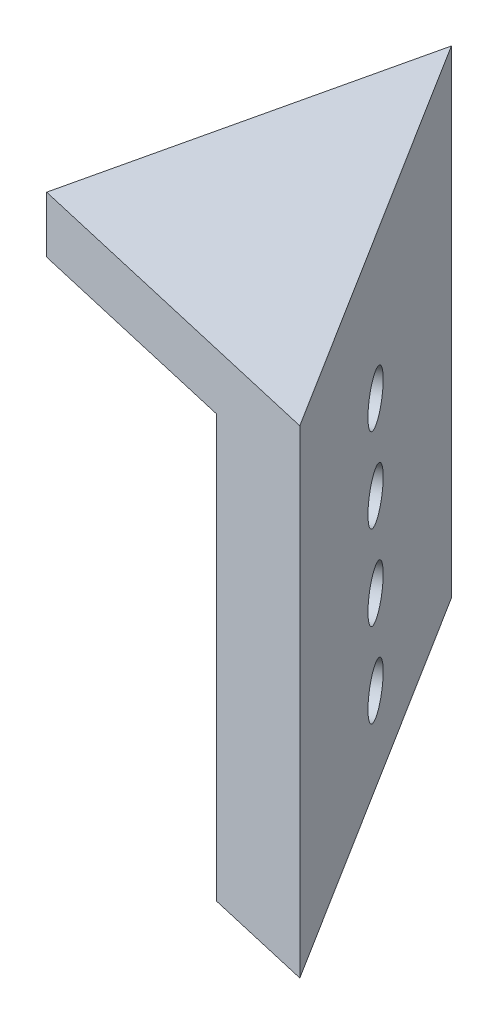
ISO-10303-21;
HEADER;
FILE_DESCRIPTION(('STEP AP214'),'2;1');
FILE_NAME('part.step','',(''),(''),'','','');
FILE_SCHEMA(('AUTOMOTIVE_DESIGN { 1 0 10303 214 1 1 1 1 }'));
ENDSEC;
DATA;
#1=APPLICATION_CONTEXT('core data for automotive mechanical design processes');
#2=APPLICATION_PROTOCOL_DEFINITION('international standard','automotive_design',2000,#1);
#3=PRODUCT_CONTEXT('',#1,'mechanical');
#4=PRODUCT('Part','Part','',(#3));
#5=PRODUCT_RELATED_PRODUCT_CATEGORY('part','',(#4));
#6=PRODUCT_DEFINITION_FORMATION('','',#4);
#7=PRODUCT_DEFINITION_CONTEXT('part definition',#1,'design');
#8=PRODUCT_DEFINITION('design','',#6,#7);
#9=PRODUCT_DEFINITION_SHAPE('','',#8);
#10=(LENGTH_UNIT() NAMED_UNIT(*) SI_UNIT(.MILLI.,.METRE.));
#11=(NAMED_UNIT(*) PLANE_ANGLE_UNIT() SI_UNIT($,.RADIAN.));
#12=(NAMED_UNIT(*) SI_UNIT($,.STERADIAN.) SOLID_ANGLE_UNIT());
#13=UNCERTAINTY_MEASURE_WITH_UNIT(LENGTH_MEASURE(1.E-05),#10,'distance_accuracy_value','');
#14=(GEOMETRIC_REPRESENTATION_CONTEXT(3) GLOBAL_UNCERTAINTY_ASSIGNED_CONTEXT((#13)) GLOBAL_UNIT_ASSIGNED_CONTEXT((#10,
#11,#12)) REPRESENTATION_CONTEXT('',''));
#15=CARTESIAN_POINT('',(0.,0.,0.));
#16=DIRECTION('',(0.,0.,1.));
#17=DIRECTION('',(1.,0.,0.));
#18=AXIS2_PLACEMENT_3D('',#15,#16,#17);
#19=CARTESIAN_POINT('',(0.,25.4,0.));
#20=DIRECTION('',(0.974478940414093,0.,0.224478940414076));
#21=DIRECTION('',(0.224478940414076,0.,-0.974478940414093));
#22=AXIS2_PLACEMENT_3D('',#19,#20,#21);
#23=PLANE('',#22);
#24=DIRECTION('',(0.,-1.,0.));
#25=VECTOR('',#24,1.);
#26=CARTESIAN_POINT('',(0.,25.4,0.));
#27=LINE('',#26,#25);
#28=CARTESIAN_POINT('',(0.,25.4,0.));
#29=VERTEX_POINT('',#28);
#30=CARTESIAN_POINT('',(0.,0.,0.));
#31=VERTEX_POINT('',#30);
#32=EDGE_CURVE('E53',#29,#31,#27,.T.);
#33=ORIENTED_EDGE('',*,*,#32,.F.);
#34=DIRECTION('',(-0.224478940414076,0.,0.974478940414093));
#35=VECTOR('',#34,1.);
#36=CARTESIAN_POINT('',(0.,25.4,0.));
#37=LINE('',#36,#35);
#38=CARTESIAN_POINT('',(34.2105905191077,25.4,-148.510590519119));
#39=VERTEX_POINT('',#38);
#40=EDGE_CURVE('E100',#39,#29,#37,.T.);
#41=ORIENTED_EDGE('',*,*,#40,.F.);
#42=DIRECTION('',(0.,-1.,0.));
#43=VECTOR('',#42,1.);
#44=CARTESIAN_POINT('',(34.2105905191077,25.4,-148.510590519119));
#45=LINE('',#44,#43);
#46=CARTESIAN_POINT('',(34.2105905191077,-190.5,-148.510590519119));
#47=VERTEX_POINT('',#46);
#48=EDGE_CURVE('E97',#39,#47,#45,.T.);
#49=ORIENTED_EDGE('',*,*,#48,.T.);
#50=DIRECTION('',(-0.224478940414076,0.,0.974478940414093));
#51=VECTOR('',#50,1.);
#52=CARTESIAN_POINT('',(34.2105905191077,-190.5,-148.510590519119));
#53=LINE('',#52,#51);
#54=CARTESIAN_POINT('',(22.983547143726,-190.5,-99.7732020039908));
#55=VERTEX_POINT('',#54);
#56=EDGE_CURVE('E99',#47,#55,#53,.T.);
#57=ORIENTED_EDGE('',*,*,#56,.T.);
#58=DIRECTION('',(0.,1.,0.));
#59=VECTOR('',#58,1.);
#60=CARTESIAN_POINT('',(22.983547143726,-190.5,-99.7732020039908));
#61=LINE('',#60,#59);
#62=CARTESIAN_POINT('',(22.983547143726,0.,-99.7732020039908));
#63=VERTEX_POINT('',#62);
#64=EDGE_CURVE('E60',#55,#63,#61,.T.);
#65=ORIENTED_EDGE('',*,*,#64,.T.);
#66=DIRECTION('',(-0.224478940414076,0.,0.974478940414093));
#67=VECTOR('',#66,1.);
#68=CARTESIAN_POINT('',(0.,0.,0.));
#69=LINE('',#68,#67);
#70=EDGE_CURVE('E77',#63,#31,#69,.T.);
#71=ORIENTED_EDGE('',*,*,#70,.T.);
#72=EDGE_LOOP('',(#33,#41,#49,#57,#65,#71));
#73=FACE_BOUND('',#72,.T.);
#74=ADVANCED_FACE('F45',(#73),#23,.F.);
#75=CARTESIAN_POINT('',(0.,25.4,0.));
#76=DIRECTION('',(0.224478940414077,0.,-0.974478940414093));
#77=DIRECTION('',(-0.974478940414093,0.,-0.224478940414077));
#78=AXIS2_PLACEMENT_3D('',#75,#76,#77);
#79=PLANE('',#78);
#80=DIRECTION('',(0.974478940414093,0.,0.224478940414077));
#81=VECTOR('',#80,1.);
#82=CARTESIAN_POINT('',(0.,0.,0.));
#83=LINE('',#82,#81);
#84=CARTESIAN_POINT('',(99.7732020039835,0.,22.9835471437244));
#85=VERTEX_POINT('',#84);
#86=EDGE_CURVE('E139',#31,#85,#83,.T.);
#87=ORIENTED_EDGE('',*,*,#86,.T.);
#88=DIRECTION('',(0.,1.,0.));
#89=VECTOR('',#88,1.);
#90=CARTESIAN_POINT('',(99.7732020039835,-190.5,22.9835471437244));
#91=LINE('',#90,#89);
#92=CARTESIAN_POINT('',(99.7732020039835,-190.5,22.9835471437244));
#93=VERTEX_POINT('',#92);
#94=EDGE_CURVE('E85',#93,#85,#91,.T.);
#95=ORIENTED_EDGE('',*,*,#94,.F.);
#96=DIRECTION('',(0.974478940414093,0.,0.224478940414075));
#97=VECTOR('',#96,1.);
#98=CARTESIAN_POINT('',(148.510590519108,-190.5,34.2105905191052));
#99=LINE('',#98,#97);
#100=CARTESIAN_POINT('',(148.510590519108,-190.5,34.2105905191052));
#101=VERTEX_POINT('',#100);
#102=EDGE_CURVE('E129',#93,#101,#99,.T.);
#103=ORIENTED_EDGE('',*,*,#102,.T.);
#104=DIRECTION('',(0.,-1.,0.));
#105=VECTOR('',#104,1.);
#106=CARTESIAN_POINT('',(148.510590519108,25.4,34.2105905191053));
#107=LINE('',#106,#105);
#108=CARTESIAN_POINT('',(148.510590519108,25.4,34.2105905191053));
#109=VERTEX_POINT('',#108);
#110=EDGE_CURVE('E104',#109,#101,#107,.T.);
#111=ORIENTED_EDGE('',*,*,#110,.F.);
#112=DIRECTION('',(0.974478940414093,0.,0.224478940414077));
#113=VECTOR('',#112,1.);
#114=CARTESIAN_POINT('',(0.,25.4,0.));
#115=LINE('',#114,#113);
#116=EDGE_CURVE('E138',#29,#109,#115,.T.);
#117=ORIENTED_EDGE('',*,*,#116,.F.);
#118=ORIENTED_EDGE('',*,*,#32,.T.);
#119=EDGE_LOOP('',(#87,#95,#103,#111,#117,#118));
#120=FACE_BOUND('',#119,.T.);
#121=ADVANCED_FACE('F154',(#120),#79,.F.);
#122=CARTESIAN_POINT('',(148.510590519108,25.4,34.2105905191053));
#123=DIRECTION('',(-0.847791247890671,0.,0.530330085889891));
#124=DIRECTION('',(0.530330085889892,0.,0.847791247890671));
#125=AXIS2_PLACEMENT_3D('',#122,#123,#124);
#126=PLANE('',#125);
#127=CARTESIAN_POINT('',(91.360590519112,-38.1,-57.1500000000001));
#128=DIRECTION('',(-0.847791247890671,0.,0.530330085889891));
#129=DIRECTION('',(0.530330085889892,0.,0.847791247890671));
#130=AXIS2_PLACEMENT_3D('',#127,#128,#129);
#131=CIRCLE('',#130,10.795);
#132=CARTESIAN_POINT('',(97.0855037962934,-38.1,-47.9980934790203));
#133=VERTEX_POINT('',#132);
#134=EDGE_CURVE('E119',#133,#133,#131,.T.);
#135=ORIENTED_EDGE('',*,*,#134,.T.);
#136=EDGE_LOOP('',(#135));
#137=FACE_BOUND('',#136,.T.);
#138=CARTESIAN_POINT('',(91.360590519112,-76.2,-57.1500000000001));
#139=DIRECTION('',(-0.847791247890671,0.,0.530330085889891));
#140=DIRECTION('',(0.530330085889892,0.,0.847791247890671));
#141=AXIS2_PLACEMENT_3D('',#138,#139,#140);
#142=CIRCLE('',#141,10.795);
#143=CARTESIAN_POINT('',(97.0855037962934,-76.2,-47.9980934790203));
#144=VERTEX_POINT('',#143);
#145=EDGE_CURVE('E123',#144,#144,#142,.T.);
#146=ORIENTED_EDGE('',*,*,#145,.T.);
#147=EDGE_LOOP('',(#146));
#148=FACE_BOUND('',#147,.T.);
#149=CARTESIAN_POINT('',(91.360590519112,-114.3,-57.1500000000001));
#150=DIRECTION('',(-0.847791247890671,0.,0.530330085889891));
#151=DIRECTION('',(0.530330085889892,0.,0.847791247890671));
#152=AXIS2_PLACEMENT_3D('',#149,#150,#151);
#153=CIRCLE('',#152,10.795);
#154=CARTESIAN_POINT('',(97.0855037962934,-114.3,-47.9980934790203));
#155=VERTEX_POINT('',#154);
#156=EDGE_CURVE('E262',#155,#155,#153,.T.);
#157=ORIENTED_EDGE('',*,*,#156,.T.);
#158=EDGE_LOOP('',(#157));
#159=FACE_BOUND('',#158,.T.);
#160=CARTESIAN_POINT('',(91.360590519112,-152.4,-57.1500000000001));
#161=DIRECTION('',(-0.847791247890671,0.,0.530330085889891));
#162=DIRECTION('',(0.530330085889892,0.,0.847791247890671));
#163=AXIS2_PLACEMENT_3D('',#160,#161,#162);
#164=CIRCLE('',#163,10.795);
#165=CARTESIAN_POINT('',(97.0855037962934,-152.4,-47.9980934790203));
#166=VERTEX_POINT('',#165);
#167=EDGE_CURVE('E265',#166,#166,#164,.T.);
#168=ORIENTED_EDGE('',*,*,#167,.T.);
#169=EDGE_LOOP('',(#168));
#170=FACE_BOUND('',#169,.T.);
#171=ORIENTED_EDGE('',*,*,#110,.T.);
#172=DIRECTION('',(-0.530330085889891,0.,-0.84779124789067));
#173=VECTOR('',#172,1.);
#174=CARTESIAN_POINT('',(34.2105905191077,-190.5,-148.510590519119));
#175=LINE('',#174,#173);
#176=EDGE_CURVE('E111',#101,#47,#175,.T.);
#177=ORIENTED_EDGE('',*,*,#176,.T.);
#178=ORIENTED_EDGE('',*,*,#48,.F.);
#179=DIRECTION('',(-0.530330085889892,0.,-0.847791247890671));
#180=VECTOR('',#179,1.);
#181=CARTESIAN_POINT('',(148.510590519108,25.4,34.2105905191053));
#182=LINE('',#181,#180);
#183=EDGE_CURVE('E68',#109,#39,#182,.T.);
#184=ORIENTED_EDGE('',*,*,#183,.F.);
#185=EDGE_LOOP('',(#171,#177,#178,#184));
#186=FACE_BOUND('',#185,.T.);
#187=ADVANCED_FACE('F116',(#137,#148,#159,#170,#186),#126,.F.);
#188=CARTESIAN_POINT('',(0.,25.4,0.));
#189=DIRECTION('',(0.,-1.,0.));
#190=DIRECTION('',(0.,0.,-1.));
#191=AXIS2_PLACEMENT_3D('',#188,#189,#190);
#192=PLANE('',#191);
#193=ORIENTED_EDGE('',*,*,#116,.T.);
#194=ORIENTED_EDGE('',*,*,#183,.T.);
#195=ORIENTED_EDGE('',*,*,#40,.T.);
#196=EDGE_LOOP('',(#193,#194,#195));
#197=FACE_BOUND('',#196,.T.);
#198=ADVANCED_FACE('F155',(#197),#192,.F.);
#199=CARTESIAN_POINT('',(0.,0.,0.));
#200=DIRECTION('',(0.,-1.,0.));
#201=DIRECTION('',(0.,0.,-1.));
#202=AXIS2_PLACEMENT_3D('',#199,#200,#201);
#203=PLANE('',#202);
#204=DIRECTION('',(-0.530330085889891,0.,-0.847791247890671));
#205=VECTOR('',#204,1.);
#206=CARTESIAN_POINT('',(61.3783745738576,0.,-38.3948274301287));
#207=LINE('',#206,#205);
#208=EDGE_CURVE('E11',#85,#63,#207,.T.);
#209=ORIENTED_EDGE('',*,*,#208,.F.);
#210=ORIENTED_EDGE('',*,*,#86,.F.);
#211=ORIENTED_EDGE('',*,*,#70,.F.);
#212=EDGE_LOOP('',(#209,#210,#211));
#213=FACE_BOUND('',#212,.T.);
#214=ADVANCED_FACE('F157',(#213),#203,.T.);
#215=CARTESIAN_POINT('',(99.7732020039835,-190.5,22.9835471437244));
#216=DIRECTION('',(-0.847791247890671,0.,0.530330085889891));
#217=DIRECTION('',(0.530330085889891,0.,0.847791247890671));
#218=AXIS2_PLACEMENT_3D('',#215,#216,#217);
#219=PLANE('',#218);
#220=CARTESIAN_POINT('',(61.3783745738575,-38.1,-38.3948274301287));
#221=DIRECTION('',(-0.847791247890671,0.,0.530330085889891));
#222=DIRECTION('',(0.530330085889891,0.,0.847791247890671));
#223=AXIS2_PLACEMENT_3D('',#220,#221,#222);
#224=CIRCLE('',#223,10.795);
#225=CARTESIAN_POINT('',(67.1032878510389,-38.1,-29.242920909149));
#226=VERTEX_POINT('',#225);
#227=EDGE_CURVE('E253',#226,#226,#224,.T.);
#228=ORIENTED_EDGE('',*,*,#227,.F.);
#229=EDGE_LOOP('',(#228));
#230=FACE_BOUND('',#229,.T.);
#231=CARTESIAN_POINT('',(61.3783745738575,-76.2,-38.3948274301288));
#232=DIRECTION('',(-0.847791247890671,0.,0.530330085889891));
#233=DIRECTION('',(0.530330085889891,0.,0.847791247890671));
#234=AXIS2_PLACEMENT_3D('',#231,#232,#233);
#235=CIRCLE('',#234,10.795);
#236=CARTESIAN_POINT('',(67.1032878510389,-76.2,-29.242920909149));
#237=VERTEX_POINT('',#236);
#238=EDGE_CURVE('E272',#237,#237,#235,.T.);
#239=ORIENTED_EDGE('',*,*,#238,.F.);
#240=EDGE_LOOP('',(#239));
#241=FACE_BOUND('',#240,.T.);
#242=CARTESIAN_POINT('',(61.3783745738575,-114.3,-38.3948274301288));
#243=DIRECTION('',(-0.847791247890671,0.,0.530330085889891));
#244=DIRECTION('',(0.530330085889891,0.,0.847791247890671));
#245=AXIS2_PLACEMENT_3D('',#242,#243,#244);
#246=CIRCLE('',#245,10.795);
#247=CARTESIAN_POINT('',(67.1032878510389,-114.3,-29.242920909149));
#248=VERTEX_POINT('',#247);
#249=EDGE_CURVE('E280',#248,#248,#246,.T.);
#250=ORIENTED_EDGE('',*,*,#249,.F.);
#251=EDGE_LOOP('',(#250));
#252=FACE_BOUND('',#251,.T.);
#253=CARTESIAN_POINT('',(61.3783745738575,-152.4,-38.3948274301288));
#254=DIRECTION('',(-0.847791247890671,0.,0.530330085889891));
#255=DIRECTION('',(0.530330085889891,0.,0.847791247890671));
#256=AXIS2_PLACEMENT_3D('',#253,#254,#255);
#257=CIRCLE('',#256,10.795);
#258=CARTESIAN_POINT('',(67.1032878510389,-152.4,-29.242920909149));
#259=VERTEX_POINT('',#258);
#260=EDGE_CURVE('E275',#259,#259,#257,.T.);
#261=ORIENTED_EDGE('',*,*,#260,.F.);
#262=EDGE_LOOP('',(#261));
#263=FACE_BOUND('',#262,.T.);
#264=ORIENTED_EDGE('',*,*,#94,.T.);
#265=ORIENTED_EDGE('',*,*,#208,.T.);
#266=ORIENTED_EDGE('',*,*,#64,.F.);
#267=DIRECTION('',(0.530330085889891,0.,0.847791247890671));
#268=VECTOR('',#267,1.);
#269=CARTESIAN_POINT('',(99.7732020039835,-190.5,22.9835471437244));
#270=LINE('',#269,#268);
#271=EDGE_CURVE('E113',#55,#93,#270,.T.);
#272=ORIENTED_EDGE('',*,*,#271,.T.);
#273=EDGE_LOOP('',(#264,#265,#266,#272));
#274=FACE_BOUND('',#273,.T.);
#275=ADVANCED_FACE('F163',(#230,#241,#252,#263,#274),#219,.T.);
#276=CARTESIAN_POINT('',(0.,-190.5,0.));
#277=DIRECTION('',(0.,-1.,0.));
#278=DIRECTION('',(0.,0.,-1.));
#279=AXIS2_PLACEMENT_3D('',#276,#277,#278);
#280=PLANE('',#279);
#281=ORIENTED_EDGE('',*,*,#176,.F.);
#282=ORIENTED_EDGE('',*,*,#102,.F.);
#283=ORIENTED_EDGE('',*,*,#271,.F.);
#284=ORIENTED_EDGE('',*,*,#56,.F.);
#285=EDGE_LOOP('',(#281,#282,#283,#284));
#286=FACE_BOUND('',#285,.T.);
#287=ADVANCED_FACE('F109',(#286),#280,.T.);
#288=CARTESIAN_POINT('',(384.386840020203,-152.4,-240.450590154177));
#289=DIRECTION('',(-0.847791247890671,0.,0.530330085889891));
#290=DIRECTION('',(0.530330085889891,0.,0.847791247890671));
#291=AXIS2_PLACEMENT_3D('',#288,#289,#290);
#292=CYLINDRICAL_SURFACE('',#291,10.795);
#293=ORIENTED_EDGE('',*,*,#260,.T.);
#294=EDGE_LOOP('',(#293));
#295=FACE_BOUND('',#294,.T.);
#296=ORIENTED_EDGE('',*,*,#167,.F.);
#297=EDGE_LOOP('',(#296));
#298=FACE_BOUND('',#297,.T.);
#299=ADVANCED_FACE('F209',(#295,#298),#292,.F.);
#300=CARTESIAN_POINT('',(384.386840020203,-114.3,-240.450590154177));
#301=DIRECTION('',(-0.847791247890671,0.,0.530330085889891));
#302=DIRECTION('',(0.530330085889891,0.,0.847791247890671));
#303=AXIS2_PLACEMENT_3D('',#300,#301,#302);
#304=CYLINDRICAL_SURFACE('',#303,10.795);
#305=ORIENTED_EDGE('',*,*,#249,.T.);
#306=EDGE_LOOP('',(#305));
#307=FACE_BOUND('',#306,.T.);
#308=ORIENTED_EDGE('',*,*,#156,.F.);
#309=EDGE_LOOP('',(#308));
#310=FACE_BOUND('',#309,.T.);
#311=ADVANCED_FACE('F217',(#307,#310),#304,.F.);
#312=CARTESIAN_POINT('',(384.386840020203,-76.2,-240.450590154177));
#313=DIRECTION('',(-0.847791247890671,0.,0.530330085889891));
#314=DIRECTION('',(0.530330085889891,0.,0.847791247890671));
#315=AXIS2_PLACEMENT_3D('',#312,#313,#314);
#316=CYLINDRICAL_SURFACE('',#315,10.795);
#317=ORIENTED_EDGE('',*,*,#238,.T.);
#318=EDGE_LOOP('',(#317));
#319=FACE_BOUND('',#318,.T.);
#320=ORIENTED_EDGE('',*,*,#145,.F.);
#321=EDGE_LOOP('',(#320));
#322=FACE_BOUND('',#321,.T.);
#323=ADVANCED_FACE('F227',(#319,#322),#316,.F.);
#324=CARTESIAN_POINT('',(384.386840020203,-38.1,-240.450590154177));
#325=DIRECTION('',(-0.847791247890671,0.,0.530330085889891));
#326=DIRECTION('',(0.530330085889891,0.,0.847791247890671));
#327=AXIS2_PLACEMENT_3D('',#324,#325,#326);
#328=CYLINDRICAL_SURFACE('',#327,10.795);
#329=ORIENTED_EDGE('',*,*,#227,.T.);
#330=EDGE_LOOP('',(#329));
#331=FACE_BOUND('',#330,.T.);
#332=ORIENTED_EDGE('',*,*,#134,.F.);
#333=EDGE_LOOP('',(#332));
#334=FACE_BOUND('',#333,.T.);
#335=ADVANCED_FACE('F237',(#331,#334),#328,.F.);
#336=CLOSED_SHELL('',(#74,#121,#187,#198,#214,#275,#287,#299,#311,#323,#335));
#337=MANIFOLD_SOLID_BREP('B2',#336);
#338=ADVANCED_BREP_SHAPE_REPRESENTATION('',(#18,#337),#14);
#339=SHAPE_DEFINITION_REPRESENTATION(#9,#338);
ENDSEC;
END-ISO-10303-21;
